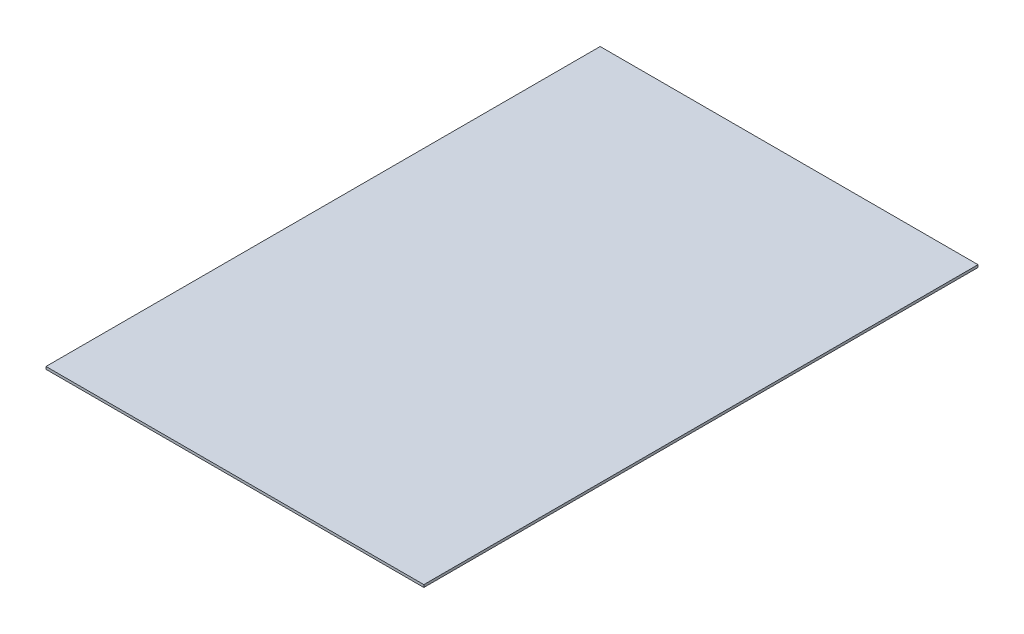
ISO-10303-21;
HEADER;
FILE_DESCRIPTION(('STEP AP214'),'2;1');
FILE_NAME('part.step','',(''),(''),'','','');
FILE_SCHEMA(('AUTOMOTIVE_DESIGN { 1 0 10303 214 1 1 1 1 }'));
ENDSEC;
DATA;
#1=APPLICATION_CONTEXT('core data for automotive mechanical design processes');
#2=APPLICATION_PROTOCOL_DEFINITION('international standard','automotive_design',2000,#1);
#3=PRODUCT_CONTEXT('',#1,'mechanical');
#4=PRODUCT('Part','Part','',(#3));
#5=PRODUCT_RELATED_PRODUCT_CATEGORY('part','',(#4));
#6=PRODUCT_DEFINITION_FORMATION('','',#4);
#7=PRODUCT_DEFINITION_CONTEXT('part definition',#1,'design');
#8=PRODUCT_DEFINITION('design','',#6,#7);
#9=PRODUCT_DEFINITION_SHAPE('','',#8);
#10=(LENGTH_UNIT() NAMED_UNIT(*) SI_UNIT(.MILLI.,.METRE.));
#11=(NAMED_UNIT(*) PLANE_ANGLE_UNIT() SI_UNIT($,.RADIAN.));
#12=(NAMED_UNIT(*) SI_UNIT($,.STERADIAN.) SOLID_ANGLE_UNIT());
#13=UNCERTAINTY_MEASURE_WITH_UNIT(LENGTH_MEASURE(1.E-05),#10,'distance_accuracy_value','');
#14=(GEOMETRIC_REPRESENTATION_CONTEXT(3) GLOBAL_UNCERTAINTY_ASSIGNED_CONTEXT((#13)) GLOBAL_UNIT_ASSIGNED_CONTEXT((#10,
#11,#12)) REPRESENTATION_CONTEXT('',''));
#15=CARTESIAN_POINT('',(0.,0.,0.));
#16=DIRECTION('',(0.,0.,1.));
#17=DIRECTION('',(1.,0.,0.));
#18=AXIS2_PLACEMENT_3D('',#15,#16,#17);
#19=CARTESIAN_POINT('',(-3750.,50.,5500.));
#20=DIRECTION('',(1.,0.,0.));
#21=DIRECTION('',(0.,0.,-1.));
#22=AXIS2_PLACEMENT_3D('',#19,#20,#21);
#23=PLANE('',#22);
#24=DIRECTION('',(0.,0.,1.));
#25=VECTOR('',#24,1.);
#26=CARTESIAN_POINT('',(-3750.,0.,5500.));
#27=LINE('',#26,#25);
#28=CARTESIAN_POINT('',(-3750.,0.,-5500.));
#29=VERTEX_POINT('',#28);
#30=CARTESIAN_POINT('',(-3750.,0.,5500.));
#31=VERTEX_POINT('',#30);
#32=EDGE_CURVE('E341',#29,#31,#27,.T.);
#33=ORIENTED_EDGE('',*,*,#32,.T.);
#34=DIRECTION('',(0.,-1.,0.));
#35=VECTOR('',#34,1.);
#36=CARTESIAN_POINT('',(-3750.,50.,5500.));
#37=LINE('',#36,#35);
#38=CARTESIAN_POINT('',(-3750.,50.,5500.));
#39=VERTEX_POINT('',#38);
#40=EDGE_CURVE('E11',#39,#31,#37,.T.);
#41=ORIENTED_EDGE('',*,*,#40,.F.);
#42=DIRECTION('',(0.,0.,1.));
#43=VECTOR('',#42,1.);
#44=CARTESIAN_POINT('',(-3750.,50.,5500.));
#45=LINE('',#44,#43);
#46=CARTESIAN_POINT('',(-3750.,50.,-5500.));
#47=VERTEX_POINT('',#46);
#48=EDGE_CURVE('E348',#47,#39,#45,.T.);
#49=ORIENTED_EDGE('',*,*,#48,.F.);
#50=DIRECTION('',(0.,-1.,0.));
#51=VECTOR('',#50,1.);
#52=CARTESIAN_POINT('',(-3750.,50.,-5500.));
#53=LINE('',#52,#51);
#54=EDGE_CURVE('E358',#47,#29,#53,.T.);
#55=ORIENTED_EDGE('',*,*,#54,.T.);
#56=EDGE_LOOP('',(#33,#41,#49,#55));
#57=FACE_BOUND('',#56,.T.);
#58=ADVANCED_FACE('F33',(#57),#23,.F.);
#59=CARTESIAN_POINT('',(3750.,50.,5500.));
#60=DIRECTION('',(0.,0.,-1.));
#61=DIRECTION('',(-1.,0.,0.));
#62=AXIS2_PLACEMENT_3D('',#59,#60,#61);
#63=PLANE('',#62);
#64=DIRECTION('',(1.,0.,0.));
#65=VECTOR('',#64,1.);
#66=CARTESIAN_POINT('',(3750.,0.,5500.));
#67=LINE('',#66,#65);
#68=CARTESIAN_POINT('',(3750.,0.,5500.));
#69=VERTEX_POINT('',#68);
#70=EDGE_CURVE('E361',#31,#69,#67,.T.);
#71=ORIENTED_EDGE('',*,*,#70,.T.);
#72=DIRECTION('',(0.,-1.,0.));
#73=VECTOR('',#72,1.);
#74=CARTESIAN_POINT('',(3750.,50.,5500.));
#75=LINE('',#74,#73);
#76=CARTESIAN_POINT('',(3750.,50.,5500.));
#77=VERTEX_POINT('',#76);
#78=EDGE_CURVE('E40',#77,#69,#75,.T.);
#79=ORIENTED_EDGE('',*,*,#78,.F.);
#80=DIRECTION('',(1.,0.,0.));
#81=VECTOR('',#80,1.);
#82=CARTESIAN_POINT('',(3750.,50.,5500.));
#83=LINE('',#82,#81);
#84=EDGE_CURVE('E351',#39,#77,#83,.T.);
#85=ORIENTED_EDGE('',*,*,#84,.F.);
#86=ORIENTED_EDGE('',*,*,#40,.T.);
#87=EDGE_LOOP('',(#71,#79,#85,#86));
#88=FACE_BOUND('',#87,.T.);
#89=ADVANCED_FACE('F390',(#88),#63,.F.);
#90=CARTESIAN_POINT('',(3750.,50.,5500.));
#91=DIRECTION('',(-1.,0.,0.));
#92=DIRECTION('',(0.,0.,1.));
#93=AXIS2_PLACEMENT_3D('',#90,#91,#92);
#94=PLANE('',#93);
#95=DIRECTION('',(0.,0.,-1.));
#96=VECTOR('',#95,1.);
#97=CARTESIAN_POINT('',(3750.,0.,5500.));
#98=LINE('',#97,#96);
#99=CARTESIAN_POINT('',(3750.,0.,-5500.));
#100=VERTEX_POINT('',#99);
#101=EDGE_CURVE('E363',#69,#100,#98,.T.);
#102=ORIENTED_EDGE('',*,*,#101,.T.);
#103=DIRECTION('',(0.,-1.,0.));
#104=VECTOR('',#103,1.);
#105=CARTESIAN_POINT('',(3750.,50.,-5500.));
#106=LINE('',#105,#104);
#107=CARTESIAN_POINT('',(3750.,50.,-5500.));
#108=VERTEX_POINT('',#107);
#109=EDGE_CURVE('E368',#108,#100,#106,.T.);
#110=ORIENTED_EDGE('',*,*,#109,.F.);
#111=DIRECTION('',(0.,0.,-1.));
#112=VECTOR('',#111,1.);
#113=CARTESIAN_POINT('',(3750.,50.,5500.));
#114=LINE('',#113,#112);
#115=EDGE_CURVE('E354',#77,#108,#114,.T.);
#116=ORIENTED_EDGE('',*,*,#115,.F.);
#117=ORIENTED_EDGE('',*,*,#78,.T.);
#118=EDGE_LOOP('',(#102,#110,#116,#117));
#119=FACE_BOUND('',#118,.T.);
#120=ADVANCED_FACE('F375',(#119),#94,.F.);
#121=CARTESIAN_POINT('',(3750.,50.,-5500.));
#122=DIRECTION('',(0.,0.,1.));
#123=DIRECTION('',(1.,0.,0.));
#124=AXIS2_PLACEMENT_3D('',#121,#122,#123);
#125=PLANE('',#124);
#126=DIRECTION('',(-1.,0.,0.));
#127=VECTOR('',#126,1.);
#128=CARTESIAN_POINT('',(3750.,0.,-5500.));
#129=LINE('',#128,#127);
#130=EDGE_CURVE('E352',#100,#29,#129,.T.);
#131=ORIENTED_EDGE('',*,*,#130,.T.);
#132=ORIENTED_EDGE('',*,*,#54,.F.);
#133=DIRECTION('',(-1.,0.,0.));
#134=VECTOR('',#133,1.);
#135=CARTESIAN_POINT('',(3750.,50.,-5500.));
#136=LINE('',#135,#134);
#137=EDGE_CURVE('E356',#108,#47,#136,.T.);
#138=ORIENTED_EDGE('',*,*,#137,.F.);
#139=ORIENTED_EDGE('',*,*,#109,.T.);
#140=EDGE_LOOP('',(#131,#132,#138,#139));
#141=FACE_BOUND('',#140,.T.);
#142=ADVANCED_FACE('F383',(#141),#125,.F.);
#143=CARTESIAN_POINT('',(0.,50.,0.));
#144=DIRECTION('',(0.,1.,0.));
#145=DIRECTION('',(0.,0.,1.));
#146=AXIS2_PLACEMENT_3D('',#143,#144,#145);
#147=PLANE('',#146);
#148=ORIENTED_EDGE('',*,*,#48,.T.);
#149=ORIENTED_EDGE('',*,*,#84,.T.);
#150=ORIENTED_EDGE('',*,*,#115,.T.);
#151=ORIENTED_EDGE('',*,*,#137,.T.);
#152=EDGE_LOOP('',(#148,#149,#150,#151));
#153=FACE_BOUND('',#152,.T.);
#154=ADVANCED_FACE('F389',(#153),#147,.T.);
#155=CARTESIAN_POINT('',(0.,0.,0.));
#156=DIRECTION('',(0.,1.,0.));
#157=DIRECTION('',(0.,0.,1.));
#158=AXIS2_PLACEMENT_3D('',#155,#156,#157);
#159=PLANE('',#158);
#160=DIRECTION('',(-1.,0.,0.));
#161=VECTOR('',#160,1.);
#162=CARTESIAN_POINT('',(249.999999999999,0.,1500.));
#163=LINE('',#162,#161);
#164=CARTESIAN_POINT('',(249.999999999999,0.,1500.));
#165=VERTEX_POINT('',#164);
#166=CARTESIAN_POINT('',(-250.000000000001,0.,1500.));
#167=VERTEX_POINT('',#166);
#168=EDGE_CURVE('E308',#165,#167,#163,.T.);
#169=ORIENTED_EDGE('',*,*,#168,.F.);
#170=DIRECTION('',(0.,0.,1.));
#171=VECTOR('',#170,1.);
#172=CARTESIAN_POINT('',(249.999999999999,0.,1000.));
#173=LINE('',#172,#171);
#174=CARTESIAN_POINT('',(249.999999999999,0.,1000.));
#175=VERTEX_POINT('',#174);
#176=EDGE_CURVE('E47',#175,#165,#173,.T.);
#177=ORIENTED_EDGE('',*,*,#176,.F.);
#178=DIRECTION('',(-1.,0.,0.));
#179=VECTOR('',#178,1.);
#180=CARTESIAN_POINT('',(249.999999999999,0.,1000.));
#181=LINE('',#180,#179);
#182=CARTESIAN_POINT('',(-250.000000000001,0.,1000.));
#183=VERTEX_POINT('',#182);
#184=EDGE_CURVE('E301',#175,#183,#181,.T.);
#185=ORIENTED_EDGE('',*,*,#184,.T.);
#186=DIRECTION('',(0.,0.,1.));
#187=VECTOR('',#186,1.);
#188=CARTESIAN_POINT('',(-250.000000000001,0.,1000.));
#189=LINE('',#188,#187);
#190=EDGE_CURVE('E304',#183,#167,#189,.T.);
#191=ORIENTED_EDGE('',*,*,#190,.T.);
#192=EDGE_LOOP('',(#169,#177,#185,#191));
#193=FACE_BOUND('',#192,.T.);
#194=DIRECTION('',(0.,0.,1.));
#195=VECTOR('',#194,1.);
#196=CARTESIAN_POINT('',(2250.,0.,0.));
#197=LINE('',#196,#195);
#198=CARTESIAN_POINT('',(2250.,0.,-3375.));
#199=VERTEX_POINT('',#198);
#200=CARTESIAN_POINT('',(2250.,0.,-2625.));
#201=VERTEX_POINT('',#200);
#202=EDGE_CURVE('E280',#199,#201,#197,.T.);
#203=ORIENTED_EDGE('',*,*,#202,.F.);
#204=DIRECTION('',(1.,0.,0.));
#205=VECTOR('',#204,1.);
#206=CARTESIAN_POINT('',(0.,0.,-3375.));
#207=LINE('',#206,#205);
#208=CARTESIAN_POINT('',(1500.,0.,-3375.));
#209=VERTEX_POINT('',#208);
#210=EDGE_CURVE('E55',#209,#199,#207,.T.);
#211=ORIENTED_EDGE('',*,*,#210,.F.);
#212=DIRECTION('',(0.,0.,1.));
#213=VECTOR('',#212,1.);
#214=CARTESIAN_POINT('',(1500.,0.,0.));
#215=LINE('',#214,#213);
#216=CARTESIAN_POINT('',(1500.,0.,-2625.));
#217=VERTEX_POINT('',#216);
#218=EDGE_CURVE('E273',#209,#217,#215,.T.);
#219=ORIENTED_EDGE('',*,*,#218,.T.);
#220=DIRECTION('',(1.,0.,0.));
#221=VECTOR('',#220,1.);
#222=CARTESIAN_POINT('',(0.,0.,-2625.));
#223=LINE('',#222,#221);
#224=EDGE_CURVE('E276',#217,#201,#223,.T.);
#225=ORIENTED_EDGE('',*,*,#224,.T.);
#226=EDGE_LOOP('',(#203,#211,#219,#225));
#227=FACE_BOUND('',#226,.T.);
#228=DIRECTION('',(0.,0.,1.));
#229=VECTOR('',#228,1.);
#230=CARTESIAN_POINT('',(-1500.,0.,0.));
#231=LINE('',#230,#229);
#232=CARTESIAN_POINT('',(-1500.,0.,-3375.));
#233=VERTEX_POINT('',#232);
#234=CARTESIAN_POINT('',(-1500.,0.,-2625.));
#235=VERTEX_POINT('',#234);
#236=EDGE_CURVE('E252',#233,#235,#231,.T.);
#237=ORIENTED_EDGE('',*,*,#236,.F.);
#238=DIRECTION('',(1.,0.,0.));
#239=VECTOR('',#238,1.);
#240=CARTESIAN_POINT('',(0.,0.,-3375.));
#241=LINE('',#240,#239);
#242=CARTESIAN_POINT('',(-2250.,0.,-3375.));
#243=VERTEX_POINT('',#242);
#244=EDGE_CURVE('E203',#243,#233,#241,.T.);
#245=ORIENTED_EDGE('',*,*,#244,.F.);
#246=DIRECTION('',(0.,0.,1.));
#247=VECTOR('',#246,1.);
#248=CARTESIAN_POINT('',(-2250.,0.,0.));
#249=LINE('',#248,#247);
#250=CARTESIAN_POINT('',(-2250.,0.,-2625.));
#251=VERTEX_POINT('',#250);
#252=EDGE_CURVE('E245',#243,#251,#249,.T.);
#253=ORIENTED_EDGE('',*,*,#252,.T.);
#254=DIRECTION('',(1.,0.,0.));
#255=VECTOR('',#254,1.);
#256=CARTESIAN_POINT('',(0.,0.,-2625.));
#257=LINE('',#256,#255);
#258=EDGE_CURVE('E248',#251,#235,#257,.T.);
#259=ORIENTED_EDGE('',*,*,#258,.T.);
#260=EDGE_LOOP('',(#237,#245,#253,#259));
#261=FACE_BOUND('',#260,.T.);
#262=DIRECTION('',(0.,0.,1.));
#263=VECTOR('',#262,1.);
#264=CARTESIAN_POINT('',(-1500.,0.,0.));
#265=LINE('',#264,#263);
#266=CARTESIAN_POINT('',(-1500.,0.,2625.));
#267=VERTEX_POINT('',#266);
#268=CARTESIAN_POINT('',(-1500.,0.,3375.));
#269=VERTEX_POINT('',#268);
#270=EDGE_CURVE('E218',#267,#269,#265,.T.);
#271=ORIENTED_EDGE('',*,*,#270,.F.);
#272=DIRECTION('',(1.,0.,0.));
#273=VECTOR('',#272,1.);
#274=CARTESIAN_POINT('',(0.,0.,2625.));
#275=LINE('',#274,#273);
#276=CARTESIAN_POINT('',(-2250.,0.,2625.));
#277=VERTEX_POINT('',#276);
#278=EDGE_CURVE('E196',#277,#267,#275,.T.);
#279=ORIENTED_EDGE('',*,*,#278,.F.);
#280=DIRECTION('',(0.,0.,1.));
#281=VECTOR('',#280,1.);
#282=CARTESIAN_POINT('',(-2250.,0.,0.));
#283=LINE('',#282,#281);
#284=CARTESIAN_POINT('',(-2250.,0.,3375.));
#285=VERTEX_POINT('',#284);
#286=EDGE_CURVE('E206',#277,#285,#283,.T.);
#287=ORIENTED_EDGE('',*,*,#286,.T.);
#288=DIRECTION('',(1.,0.,0.));
#289=VECTOR('',#288,1.);
#290=CARTESIAN_POINT('',(0.,0.,3375.));
#291=LINE('',#290,#289);
#292=EDGE_CURVE('E212',#285,#269,#291,.T.);
#293=ORIENTED_EDGE('',*,*,#292,.T.);
#294=EDGE_LOOP('',(#271,#279,#287,#293));
#295=FACE_BOUND('',#294,.T.);
#296=DIRECTION('',(0.,0.,1.));
#297=VECTOR('',#296,1.);
#298=CARTESIAN_POINT('',(2250.,0.,0.));
#299=LINE('',#298,#297);
#300=CARTESIAN_POINT('',(2250.,0.,2625.));
#301=VERTEX_POINT('',#300);
#302=CARTESIAN_POINT('',(2250.,0.,3375.));
#303=VERTEX_POINT('',#302);
#304=EDGE_CURVE('E221',#301,#303,#299,.T.);
#305=ORIENTED_EDGE('',*,*,#304,.F.);
#306=DIRECTION('',(1.,0.,0.));
#307=VECTOR('',#306,1.);
#308=CARTESIAN_POINT('',(0.,0.,2625.));
#309=LINE('',#308,#307);
#310=CARTESIAN_POINT('',(1500.,0.,2625.));
#311=VERTEX_POINT('',#310);
#312=EDGE_CURVE('E219',#311,#301,#309,.T.);
#313=ORIENTED_EDGE('',*,*,#312,.F.);
#314=DIRECTION('',(0.,0.,1.));
#315=VECTOR('',#314,1.);
#316=CARTESIAN_POINT('',(1500.,0.,0.));
#317=LINE('',#316,#315);
#318=CARTESIAN_POINT('',(1500.,0.,3375.));
#319=VERTEX_POINT('',#318);
#320=EDGE_CURVE('E324',#311,#319,#317,.T.);
#321=ORIENTED_EDGE('',*,*,#320,.T.);
#322=DIRECTION('',(1.,0.,0.));
#323=VECTOR('',#322,1.);
#324=CARTESIAN_POINT('',(0.,0.,3375.));
#325=LINE('',#324,#323);
#326=EDGE_CURVE('E334',#319,#303,#325,.T.);
#327=ORIENTED_EDGE('',*,*,#326,.T.);
#328=EDGE_LOOP('',(#305,#313,#321,#327));
#329=FACE_BOUND('',#328,.T.);
#330=ORIENTED_EDGE('',*,*,#32,.F.);
#331=ORIENTED_EDGE('',*,*,#130,.F.);
#332=ORIENTED_EDGE('',*,*,#101,.F.);
#333=ORIENTED_EDGE('',*,*,#70,.F.);
#334=EDGE_LOOP('',(#330,#331,#332,#333));
#335=FACE_BOUND('',#334,.T.);
#336=ADVANCED_FACE('F215',(#193,#227,#261,#295,#329,#335),#159,.F.);
#337=CARTESIAN_POINT('',(0.,10.,2625.));
#338=DIRECTION('',(0.,0.,-1.));
#339=DIRECTION('',(-1.,0.,0.));
#340=AXIS2_PLACEMENT_3D('',#337,#338,#339);
#341=PLANE('',#340);
#342=ORIENTED_EDGE('',*,*,#312,.T.);
#343=DIRECTION('',(0.,-1.,0.));
#344=VECTOR('',#343,1.);
#345=CARTESIAN_POINT('',(2250.,10.,2625.));
#346=LINE('',#345,#344);
#347=CARTESIAN_POINT('',(2250.,10.,2625.));
#348=VERTEX_POINT('',#347);
#349=EDGE_CURVE('E330',#348,#301,#346,.T.);
#350=ORIENTED_EDGE('',*,*,#349,.F.);
#351=DIRECTION('',(1.,0.,0.));
#352=VECTOR('',#351,1.);
#353=CARTESIAN_POINT('',(0.,10.,2625.));
#354=LINE('',#353,#352);
#355=CARTESIAN_POINT('',(1500.,10.,2625.));
#356=VERTEX_POINT('',#355);
#357=EDGE_CURVE('E320',#356,#348,#354,.T.);
#358=ORIENTED_EDGE('',*,*,#357,.F.);
#359=DIRECTION('',(0.,-1.,0.));
#360=VECTOR('',#359,1.);
#361=CARTESIAN_POINT('',(1500.,10.,2625.));
#362=LINE('',#361,#360);
#363=EDGE_CURVE('E339',#356,#311,#362,.T.);
#364=ORIENTED_EDGE('',*,*,#363,.T.);
#365=EDGE_LOOP('',(#342,#350,#358,#364));
#366=FACE_BOUND('',#365,.T.);
#367=ADVANCED_FACE('F402',(#366),#341,.F.);
#368=CARTESIAN_POINT('',(1500.,10.,0.));
#369=DIRECTION('',(1.,0.,0.));
#370=DIRECTION('',(0.,0.,-1.));
#371=AXIS2_PLACEMENT_3D('',#368,#369,#370);
#372=PLANE('',#371);
#373=ORIENTED_EDGE('',*,*,#320,.F.);
#374=ORIENTED_EDGE('',*,*,#363,.F.);
#375=DIRECTION('',(0.,0.,1.));
#376=VECTOR('',#375,1.);
#377=CARTESIAN_POINT('',(1500.,10.,0.));
#378=LINE('',#377,#376);
#379=CARTESIAN_POINT('',(1500.,10.,3375.));
#380=VERTEX_POINT('',#379);
#381=EDGE_CURVE('E329',#356,#380,#378,.T.);
#382=ORIENTED_EDGE('',*,*,#381,.T.);
#383=DIRECTION('',(0.,-1.,0.));
#384=VECTOR('',#383,1.);
#385=CARTESIAN_POINT('',(1500.,10.,3375.));
#386=LINE('',#385,#384);
#387=EDGE_CURVE('E342',#380,#319,#386,.T.);
#388=ORIENTED_EDGE('',*,*,#387,.T.);
#389=EDGE_LOOP('',(#373,#374,#382,#388));
#390=FACE_BOUND('',#389,.T.);
#391=ADVANCED_FACE('F408',(#390),#372,.T.);
#392=CARTESIAN_POINT('',(0.,10.,3375.));
#393=DIRECTION('',(0.,0.,-1.));
#394=DIRECTION('',(-1.,0.,0.));
#395=AXIS2_PLACEMENT_3D('',#392,#393,#394);
#396=PLANE('',#395);
#397=ORIENTED_EDGE('',*,*,#326,.F.);
#398=ORIENTED_EDGE('',*,*,#387,.F.);
#399=DIRECTION('',(1.,0.,0.));
#400=VECTOR('',#399,1.);
#401=CARTESIAN_POINT('',(0.,10.,3375.));
#402=LINE('',#401,#400);
#403=CARTESIAN_POINT('',(2250.,10.,3375.));
#404=VERTEX_POINT('',#403);
#405=EDGE_CURVE('E327',#380,#404,#402,.T.);
#406=ORIENTED_EDGE('',*,*,#405,.T.);
#407=DIRECTION('',(0.,-1.,0.));
#408=VECTOR('',#407,1.);
#409=CARTESIAN_POINT('',(2250.,10.,3375.));
#410=LINE('',#409,#408);
#411=EDGE_CURVE('E344',#404,#303,#410,.T.);
#412=ORIENTED_EDGE('',*,*,#411,.T.);
#413=EDGE_LOOP('',(#397,#398,#406,#412));
#414=FACE_BOUND('',#413,.T.);
#415=ADVANCED_FACE('F414',(#414),#396,.T.);
#416=CARTESIAN_POINT('',(2250.,10.,0.));
#417=DIRECTION('',(1.,0.,0.));
#418=DIRECTION('',(0.,0.,-1.));
#419=AXIS2_PLACEMENT_3D('',#416,#417,#418);
#420=PLANE('',#419);
#421=ORIENTED_EDGE('',*,*,#304,.T.);
#422=ORIENTED_EDGE('',*,*,#411,.F.);
#423=DIRECTION('',(0.,0.,1.));
#424=VECTOR('',#423,1.);
#425=CARTESIAN_POINT('',(2250.,10.,0.));
#426=LINE('',#425,#424);
#427=EDGE_CURVE('E323',#348,#404,#426,.T.);
#428=ORIENTED_EDGE('',*,*,#427,.F.);
#429=ORIENTED_EDGE('',*,*,#349,.T.);
#430=EDGE_LOOP('',(#421,#422,#428,#429));
#431=FACE_BOUND('',#430,.T.);
#432=ADVANCED_FACE('F410',(#431),#420,.F.);
#433=CARTESIAN_POINT('',(0.,10.,0.));
#434=DIRECTION('',(0.,-1.,0.));
#435=DIRECTION('',(0.,0.,-1.));
#436=AXIS2_PLACEMENT_3D('',#433,#434,#435);
#437=PLANE('',#436);
#438=ORIENTED_EDGE('',*,*,#357,.T.);
#439=ORIENTED_EDGE('',*,*,#427,.T.);
#440=ORIENTED_EDGE('',*,*,#405,.F.);
#441=ORIENTED_EDGE('',*,*,#381,.F.);
#442=EDGE_LOOP('',(#438,#439,#440,#441));
#443=FACE_BOUND('',#442,.T.);
#444=ADVANCED_FACE('F413',(#443),#437,.T.);
#445=CARTESIAN_POINT('',(0.,10.,2625.));
#446=DIRECTION('',(0.,0.,-1.));
#447=DIRECTION('',(-1.,0.,0.));
#448=AXIS2_PLACEMENT_3D('',#445,#446,#447);
#449=PLANE('',#448);
#450=ORIENTED_EDGE('',*,*,#278,.T.);
#451=DIRECTION('',(0.,-1.,0.));
#452=VECTOR('',#451,1.);
#453=CARTESIAN_POINT('',(-1500.,10.,2625.));
#454=LINE('',#453,#452);
#455=CARTESIAN_POINT('',(-1500.,10.,2625.));
#456=VERTEX_POINT('',#455);
#457=EDGE_CURVE('E229',#456,#267,#454,.T.);
#458=ORIENTED_EDGE('',*,*,#457,.F.);
#459=DIRECTION('',(1.,0.,0.));
#460=VECTOR('',#459,1.);
#461=CARTESIAN_POINT('',(0.,10.,2625.));
#462=LINE('',#461,#460);
#463=CARTESIAN_POINT('',(-2250.,10.,2625.));
#464=VERTEX_POINT('',#463);
#465=EDGE_CURVE('E199',#464,#456,#462,.T.);
#466=ORIENTED_EDGE('',*,*,#465,.F.);
#467=DIRECTION('',(0.,-1.,0.));
#468=VECTOR('',#467,1.);
#469=CARTESIAN_POINT('',(-2250.,10.,2625.));
#470=LINE('',#469,#468);
#471=EDGE_CURVE('E192',#464,#277,#470,.T.);
#472=ORIENTED_EDGE('',*,*,#471,.T.);
#473=EDGE_LOOP('',(#450,#458,#466,#472));
#474=FACE_BOUND('',#473,.T.);
#475=ADVANCED_FACE('F194',(#474),#449,.F.);
#476=CARTESIAN_POINT('',(-2250.,10.,0.));
#477=DIRECTION('',(1.,0.,0.));
#478=DIRECTION('',(0.,0.,-1.));
#479=AXIS2_PLACEMENT_3D('',#476,#477,#478);
#480=PLANE('',#479);
#481=ORIENTED_EDGE('',*,*,#286,.F.);
#482=ORIENTED_EDGE('',*,*,#471,.F.);
#483=DIRECTION('',(0.,0.,1.));
#484=VECTOR('',#483,1.);
#485=CARTESIAN_POINT('',(-2250.,10.,0.));
#486=LINE('',#485,#484);
#487=CARTESIAN_POINT('',(-2250.,10.,3375.));
#488=VERTEX_POINT('',#487);
#489=EDGE_CURVE('E226',#464,#488,#486,.T.);
#490=ORIENTED_EDGE('',*,*,#489,.T.);
#491=DIRECTION('',(0.,-1.,0.));
#492=VECTOR('',#491,1.);
#493=CARTESIAN_POINT('',(-2250.,10.,3375.));
#494=LINE('',#493,#492);
#495=EDGE_CURVE('E202',#488,#285,#494,.T.);
#496=ORIENTED_EDGE('',*,*,#495,.T.);
#497=EDGE_LOOP('',(#481,#482,#490,#496));
#498=FACE_BOUND('',#497,.T.);
#499=ADVANCED_FACE('F207',(#498),#480,.T.);
#500=CARTESIAN_POINT('',(0.,10.,3375.));
#501=DIRECTION('',(0.,0.,-1.));
#502=DIRECTION('',(-1.,0.,0.));
#503=AXIS2_PLACEMENT_3D('',#500,#501,#502);
#504=PLANE('',#503);
#505=ORIENTED_EDGE('',*,*,#292,.F.);
#506=ORIENTED_EDGE('',*,*,#495,.F.);
#507=DIRECTION('',(1.,0.,0.));
#508=VECTOR('',#507,1.);
#509=CARTESIAN_POINT('',(0.,10.,3375.));
#510=LINE('',#509,#508);
#511=CARTESIAN_POINT('',(-1500.,10.,3375.));
#512=VERTEX_POINT('',#511);
#513=EDGE_CURVE('E228',#488,#512,#510,.T.);
#514=ORIENTED_EDGE('',*,*,#513,.T.);
#515=DIRECTION('',(0.,-1.,0.));
#516=VECTOR('',#515,1.);
#517=CARTESIAN_POINT('',(-1500.,10.,3375.));
#518=LINE('',#517,#516);
#519=EDGE_CURVE('E684',#512,#269,#518,.T.);
#520=ORIENTED_EDGE('',*,*,#519,.T.);
#521=EDGE_LOOP('',(#505,#506,#514,#520));
#522=FACE_BOUND('',#521,.T.);
#523=ADVANCED_FACE('F490',(#522),#504,.T.);
#524=CARTESIAN_POINT('',(-1500.,10.,0.));
#525=DIRECTION('',(1.,0.,0.));
#526=DIRECTION('',(0.,0.,-1.));
#527=AXIS2_PLACEMENT_3D('',#524,#525,#526);
#528=PLANE('',#527);
#529=ORIENTED_EDGE('',*,*,#270,.T.);
#530=ORIENTED_EDGE('',*,*,#519,.F.);
#531=DIRECTION('',(0.,0.,1.));
#532=VECTOR('',#531,1.);
#533=CARTESIAN_POINT('',(-1500.,10.,0.));
#534=LINE('',#533,#532);
#535=EDGE_CURVE('E231',#456,#512,#534,.T.);
#536=ORIENTED_EDGE('',*,*,#535,.F.);
#537=ORIENTED_EDGE('',*,*,#457,.T.);
#538=EDGE_LOOP('',(#529,#530,#536,#537));
#539=FACE_BOUND('',#538,.T.);
#540=ADVANCED_FACE('F486',(#539),#528,.F.);
#541=CARTESIAN_POINT('',(0.,10.,0.));
#542=DIRECTION('',(0.,-1.,0.));
#543=DIRECTION('',(0.,0.,-1.));
#544=AXIS2_PLACEMENT_3D('',#541,#542,#543);
#545=PLANE('',#544);
#546=ORIENTED_EDGE('',*,*,#465,.T.);
#547=ORIENTED_EDGE('',*,*,#535,.T.);
#548=ORIENTED_EDGE('',*,*,#513,.F.);
#549=ORIENTED_EDGE('',*,*,#489,.F.);
#550=EDGE_LOOP('',(#546,#547,#548,#549));
#551=FACE_BOUND('',#550,.T.);
#552=ADVANCED_FACE('F482',(#551),#545,.T.);
#553=CARTESIAN_POINT('',(0.,10.,-3375.));
#554=DIRECTION('',(0.,0.,-1.));
#555=DIRECTION('',(-1.,0.,0.));
#556=AXIS2_PLACEMENT_3D('',#553,#554,#555);
#557=PLANE('',#556);
#558=ORIENTED_EDGE('',*,*,#244,.T.);
#559=DIRECTION('',(0.,-1.,0.));
#560=VECTOR('',#559,1.);
#561=CARTESIAN_POINT('',(-1500.,10.,-3375.));
#562=LINE('',#561,#560);
#563=CARTESIAN_POINT('',(-1500.,10.,-3375.));
#564=VERTEX_POINT('',#563);
#565=EDGE_CURVE('E235',#564,#233,#562,.T.);
#566=ORIENTED_EDGE('',*,*,#565,.F.);
#567=DIRECTION('',(1.,0.,0.));
#568=VECTOR('',#567,1.);
#569=CARTESIAN_POINT('',(0.,10.,-3375.));
#570=LINE('',#569,#568);
#571=CARTESIAN_POINT('',(-2250.,10.,-3375.));
#572=VERTEX_POINT('',#571);
#573=EDGE_CURVE('E249',#572,#564,#570,.T.);
#574=ORIENTED_EDGE('',*,*,#573,.F.);
#575=DIRECTION('',(0.,-1.,0.));
#576=VECTOR('',#575,1.);
#577=CARTESIAN_POINT('',(-2250.,10.,-3375.));
#578=LINE('',#577,#576);
#579=EDGE_CURVE('E243',#572,#243,#578,.T.);
#580=ORIENTED_EDGE('',*,*,#579,.T.);
#581=EDGE_LOOP('',(#558,#566,#574,#580));
#582=FACE_BOUND('',#581,.T.);
#583=ADVANCED_FACE('F472',(#582),#557,.F.);
#584=CARTESIAN_POINT('',(-2250.,10.,0.));
#585=DIRECTION('',(1.,0.,0.));
#586=DIRECTION('',(0.,0.,-1.));
#587=AXIS2_PLACEMENT_3D('',#584,#585,#586);
#588=PLANE('',#587);
#589=ORIENTED_EDGE('',*,*,#252,.F.);
#590=ORIENTED_EDGE('',*,*,#579,.F.);
#591=DIRECTION('',(0.,0.,1.));
#592=VECTOR('',#591,1.);
#593=CARTESIAN_POINT('',(-2250.,10.,0.));
#594=LINE('',#593,#592);
#595=CARTESIAN_POINT('',(-2250.,10.,-2625.));
#596=VERTEX_POINT('',#595);
#597=EDGE_CURVE('E238',#572,#596,#594,.T.);
#598=ORIENTED_EDGE('',*,*,#597,.T.);
#599=DIRECTION('',(0.,-1.,0.));
#600=VECTOR('',#599,1.);
#601=CARTESIAN_POINT('',(-2250.,10.,-2625.));
#602=LINE('',#601,#600);
#603=EDGE_CURVE('E241',#596,#251,#602,.T.);
#604=ORIENTED_EDGE('',*,*,#603,.T.);
#605=EDGE_LOOP('',(#589,#590,#598,#604));
#606=FACE_BOUND('',#605,.T.);
#607=ADVANCED_FACE('F468',(#606),#588,.T.);
#608=CARTESIAN_POINT('',(0.,10.,-2625.));
#609=DIRECTION('',(0.,0.,-1.));
#610=DIRECTION('',(-1.,0.,0.));
#611=AXIS2_PLACEMENT_3D('',#608,#609,#610);
#612=PLANE('',#611);
#613=ORIENTED_EDGE('',*,*,#258,.F.);
#614=ORIENTED_EDGE('',*,*,#603,.F.);
#615=DIRECTION('',(1.,0.,0.));
#616=VECTOR('',#615,1.);
#617=CARTESIAN_POINT('',(0.,10.,-2625.));
#618=LINE('',#617,#616);
#619=CARTESIAN_POINT('',(-1500.,10.,-2625.));
#620=VERTEX_POINT('',#619);
#621=EDGE_CURVE('E257',#596,#620,#618,.T.);
#622=ORIENTED_EDGE('',*,*,#621,.T.);
#623=DIRECTION('',(0.,-1.,0.));
#624=VECTOR('',#623,1.);
#625=CARTESIAN_POINT('',(-1500.,10.,-2625.));
#626=LINE('',#625,#624);
#627=EDGE_CURVE('E239',#620,#235,#626,.T.);
#628=ORIENTED_EDGE('',*,*,#627,.T.);
#629=EDGE_LOOP('',(#613,#614,#622,#628));
#630=FACE_BOUND('',#629,.T.);
#631=ADVANCED_FACE('F471',(#630),#612,.T.);
#632=CARTESIAN_POINT('',(-1500.,10.,0.));
#633=DIRECTION('',(1.,0.,0.));
#634=DIRECTION('',(0.,0.,-1.));
#635=AXIS2_PLACEMENT_3D('',#632,#633,#634);
#636=PLANE('',#635);
#637=ORIENTED_EDGE('',*,*,#236,.T.);
#638=ORIENTED_EDGE('',*,*,#627,.F.);
#639=DIRECTION('',(0.,0.,1.));
#640=VECTOR('',#639,1.);
#641=CARTESIAN_POINT('',(-1500.,10.,0.));
#642=LINE('',#641,#640);
#643=EDGE_CURVE('E259',#564,#620,#642,.T.);
#644=ORIENTED_EDGE('',*,*,#643,.F.);
#645=ORIENTED_EDGE('',*,*,#565,.T.);
#646=EDGE_LOOP('',(#637,#638,#644,#645));
#647=FACE_BOUND('',#646,.T.);
#648=ADVANCED_FACE('F466',(#647),#636,.F.);
#649=CARTESIAN_POINT('',(0.,10.,0.));
#650=DIRECTION('',(0.,-1.,0.));
#651=DIRECTION('',(0.,0.,-1.));
#652=AXIS2_PLACEMENT_3D('',#649,#650,#651);
#653=PLANE('',#652);
#654=ORIENTED_EDGE('',*,*,#573,.T.);
#655=ORIENTED_EDGE('',*,*,#643,.T.);
#656=ORIENTED_EDGE('',*,*,#621,.F.);
#657=ORIENTED_EDGE('',*,*,#597,.F.);
#658=EDGE_LOOP('',(#654,#655,#656,#657));
#659=FACE_BOUND('',#658,.T.);
#660=ADVANCED_FACE('F463',(#659),#653,.T.);
#661=CARTESIAN_POINT('',(0.,10.,-3375.));
#662=DIRECTION('',(0.,0.,-1.));
#663=DIRECTION('',(-1.,0.,0.));
#664=AXIS2_PLACEMENT_3D('',#661,#662,#663);
#665=PLANE('',#664);
#666=ORIENTED_EDGE('',*,*,#210,.T.);
#667=DIRECTION('',(0.,-1.,0.));
#668=VECTOR('',#667,1.);
#669=CARTESIAN_POINT('',(2250.,10.,-3375.));
#670=LINE('',#669,#668);
#671=CARTESIAN_POINT('',(2250.,10.,-3375.));
#672=VERTEX_POINT('',#671);
#673=EDGE_CURVE('E264',#672,#199,#670,.T.);
#674=ORIENTED_EDGE('',*,*,#673,.F.);
#675=DIRECTION('',(1.,0.,0.));
#676=VECTOR('',#675,1.);
#677=CARTESIAN_POINT('',(0.,10.,-3375.));
#678=LINE('',#677,#676);
#679=CARTESIAN_POINT('',(1500.,10.,-3375.));
#680=VERTEX_POINT('',#679);
#681=EDGE_CURVE('E277',#680,#672,#678,.T.);
#682=ORIENTED_EDGE('',*,*,#681,.F.);
#683=DIRECTION('',(0.,-1.,0.));
#684=VECTOR('',#683,1.);
#685=CARTESIAN_POINT('',(1500.,10.,-3375.));
#686=LINE('',#685,#684);
#687=EDGE_CURVE('E271',#680,#209,#686,.T.);
#688=ORIENTED_EDGE('',*,*,#687,.T.);
#689=EDGE_LOOP('',(#666,#674,#682,#688));
#690=FACE_BOUND('',#689,.T.);
#691=ADVANCED_FACE('F453',(#690),#665,.F.);
#692=CARTESIAN_POINT('',(1500.,10.,0.));
#693=DIRECTION('',(1.,0.,0.));
#694=DIRECTION('',(0.,0.,-1.));
#695=AXIS2_PLACEMENT_3D('',#692,#693,#694);
#696=PLANE('',#695);
#697=ORIENTED_EDGE('',*,*,#218,.F.);
#698=ORIENTED_EDGE('',*,*,#687,.F.);
#699=DIRECTION('',(0.,0.,1.));
#700=VECTOR('',#699,1.);
#701=CARTESIAN_POINT('',(1500.,10.,0.));
#702=LINE('',#701,#700);
#703=CARTESIAN_POINT('',(1500.,10.,-2625.));
#704=VERTEX_POINT('',#703);
#705=EDGE_CURVE('E266',#680,#704,#702,.T.);
#706=ORIENTED_EDGE('',*,*,#705,.T.);
#707=DIRECTION('',(0.,-1.,0.));
#708=VECTOR('',#707,1.);
#709=CARTESIAN_POINT('',(1500.,10.,-2625.));
#710=LINE('',#709,#708);
#711=EDGE_CURVE('E269',#704,#217,#710,.T.);
#712=ORIENTED_EDGE('',*,*,#711,.T.);
#713=EDGE_LOOP('',(#697,#698,#706,#712));
#714=FACE_BOUND('',#713,.T.);
#715=ADVANCED_FACE('F449',(#714),#696,.T.);
#716=CARTESIAN_POINT('',(0.,10.,-2625.));
#717=DIRECTION('',(0.,0.,-1.));
#718=DIRECTION('',(-1.,0.,0.));
#719=AXIS2_PLACEMENT_3D('',#716,#717,#718);
#720=PLANE('',#719);
#721=ORIENTED_EDGE('',*,*,#224,.F.);
#722=ORIENTED_EDGE('',*,*,#711,.F.);
#723=DIRECTION('',(1.,0.,0.));
#724=VECTOR('',#723,1.);
#725=CARTESIAN_POINT('',(0.,10.,-2625.));
#726=LINE('',#725,#724);
#727=CARTESIAN_POINT('',(2250.,10.,-2625.));
#728=VERTEX_POINT('',#727);
#729=EDGE_CURVE('E285',#704,#728,#726,.T.);
#730=ORIENTED_EDGE('',*,*,#729,.T.);
#731=DIRECTION('',(0.,-1.,0.));
#732=VECTOR('',#731,1.);
#733=CARTESIAN_POINT('',(2250.,10.,-2625.));
#734=LINE('',#733,#732);
#735=EDGE_CURVE('E267',#728,#201,#734,.T.);
#736=ORIENTED_EDGE('',*,*,#735,.T.);
#737=EDGE_LOOP('',(#721,#722,#730,#736));
#738=FACE_BOUND('',#737,.T.);
#739=ADVANCED_FACE('F452',(#738),#720,.T.);
#740=CARTESIAN_POINT('',(2250.,10.,0.));
#741=DIRECTION('',(1.,0.,0.));
#742=DIRECTION('',(0.,0.,-1.));
#743=AXIS2_PLACEMENT_3D('',#740,#741,#742);
#744=PLANE('',#743);
#745=ORIENTED_EDGE('',*,*,#202,.T.);
#746=ORIENTED_EDGE('',*,*,#735,.F.);
#747=DIRECTION('',(0.,0.,1.));
#748=VECTOR('',#747,1.);
#749=CARTESIAN_POINT('',(2250.,10.,0.));
#750=LINE('',#749,#748);
#751=EDGE_CURVE('E287',#672,#728,#750,.T.);
#752=ORIENTED_EDGE('',*,*,#751,.F.);
#753=ORIENTED_EDGE('',*,*,#673,.T.);
#754=EDGE_LOOP('',(#745,#746,#752,#753));
#755=FACE_BOUND('',#754,.T.);
#756=ADVANCED_FACE('F447',(#755),#744,.F.);
#757=CARTESIAN_POINT('',(0.,10.,0.));
#758=DIRECTION('',(0.,-1.,0.));
#759=DIRECTION('',(0.,0.,-1.));
#760=AXIS2_PLACEMENT_3D('',#757,#758,#759);
#761=PLANE('',#760);
#762=ORIENTED_EDGE('',*,*,#681,.T.);
#763=ORIENTED_EDGE('',*,*,#751,.T.);
#764=ORIENTED_EDGE('',*,*,#729,.F.);
#765=ORIENTED_EDGE('',*,*,#705,.F.);
#766=EDGE_LOOP('',(#762,#763,#764,#765));
#767=FACE_BOUND('',#766,.T.);
#768=ADVANCED_FACE('F444',(#767),#761,.T.);
#769=CARTESIAN_POINT('',(249.999999999999,10.,1000.));
#770=DIRECTION('',(1.,0.,0.));
#771=DIRECTION('',(0.,0.,-1.));
#772=AXIS2_PLACEMENT_3D('',#769,#770,#771);
#773=PLANE('',#772);
#774=ORIENTED_EDGE('',*,*,#176,.T.);
#775=DIRECTION('',(0.,-1.,0.));
#776=VECTOR('',#775,1.);
#777=CARTESIAN_POINT('',(249.999999999999,10.,1500.));
#778=LINE('',#777,#776);
#779=CARTESIAN_POINT('',(249.999999999999,10.,1500.));
#780=VERTEX_POINT('',#779);
#781=EDGE_CURVE('E292',#780,#165,#778,.T.);
#782=ORIENTED_EDGE('',*,*,#781,.F.);
#783=DIRECTION('',(0.,0.,1.));
#784=VECTOR('',#783,1.);
#785=CARTESIAN_POINT('',(249.999999999999,10.,1000.));
#786=LINE('',#785,#784);
#787=CARTESIAN_POINT('',(249.999999999999,10.,1000.));
#788=VERTEX_POINT('',#787);
#789=EDGE_CURVE('E305',#788,#780,#786,.T.);
#790=ORIENTED_EDGE('',*,*,#789,.F.);
#791=DIRECTION('',(0.,-1.,0.));
#792=VECTOR('',#791,1.);
#793=CARTESIAN_POINT('',(249.999999999999,10.,1000.));
#794=LINE('',#793,#792);
#795=EDGE_CURVE('E299',#788,#175,#794,.T.);
#796=ORIENTED_EDGE('',*,*,#795,.T.);
#797=EDGE_LOOP('',(#774,#782,#790,#796));
#798=FACE_BOUND('',#797,.T.);
#799=ADVANCED_FACE('F434',(#798),#773,.F.);
#800=CARTESIAN_POINT('',(249.999999999999,10.,1000.));
#801=DIRECTION('',(0.,0.,1.));
#802=DIRECTION('',(1.,0.,0.));
#803=AXIS2_PLACEMENT_3D('',#800,#801,#802);
#804=PLANE('',#803);
#805=ORIENTED_EDGE('',*,*,#184,.F.);
#806=ORIENTED_EDGE('',*,*,#795,.F.);
#807=DIRECTION('',(-1.,0.,0.));
#808=VECTOR('',#807,1.);
#809=CARTESIAN_POINT('',(249.999999999999,10.,1000.));
#810=LINE('',#809,#808);
#811=CARTESIAN_POINT('',(-250.000000000001,10.,1000.));
#812=VERTEX_POINT('',#811);
#813=EDGE_CURVE('E294',#788,#812,#810,.T.);
#814=ORIENTED_EDGE('',*,*,#813,.T.);
#815=DIRECTION('',(0.,-1.,0.));
#816=VECTOR('',#815,1.);
#817=CARTESIAN_POINT('',(-250.000000000001,10.,1000.));
#818=LINE('',#817,#816);
#819=EDGE_CURVE('E297',#812,#183,#818,.T.);
#820=ORIENTED_EDGE('',*,*,#819,.T.);
#821=EDGE_LOOP('',(#805,#806,#814,#820));
#822=FACE_BOUND('',#821,.T.);
#823=ADVANCED_FACE('F430',(#822),#804,.T.);
#824=CARTESIAN_POINT('',(-250.000000000001,10.,1000.));
#825=DIRECTION('',(1.,0.,0.));
#826=DIRECTION('',(0.,0.,-1.));
#827=AXIS2_PLACEMENT_3D('',#824,#825,#826);
#828=PLANE('',#827);
#829=ORIENTED_EDGE('',*,*,#190,.F.);
#830=ORIENTED_EDGE('',*,*,#819,.F.);
#831=DIRECTION('',(0.,0.,1.));
#832=VECTOR('',#831,1.);
#833=CARTESIAN_POINT('',(-250.000000000001,10.,1000.));
#834=LINE('',#833,#832);
#835=CARTESIAN_POINT('',(-250.000000000001,10.,1500.));
#836=VERTEX_POINT('',#835);
#837=EDGE_CURVE('E313',#812,#836,#834,.T.);
#838=ORIENTED_EDGE('',*,*,#837,.T.);
#839=DIRECTION('',(0.,-1.,0.));
#840=VECTOR('',#839,1.);
#841=CARTESIAN_POINT('',(-250.000000000001,10.,1500.));
#842=LINE('',#841,#840);
#843=EDGE_CURVE('E295',#836,#167,#842,.T.);
#844=ORIENTED_EDGE('',*,*,#843,.T.);
#845=EDGE_LOOP('',(#829,#830,#838,#844));
#846=FACE_BOUND('',#845,.T.);
#847=ADVANCED_FACE('F433',(#846),#828,.T.);
#848=CARTESIAN_POINT('',(249.999999999999,10.,1500.));
#849=DIRECTION('',(0.,0.,1.));
#850=DIRECTION('',(1.,0.,0.));
#851=AXIS2_PLACEMENT_3D('',#848,#849,#850);
#852=PLANE('',#851);
#853=ORIENTED_EDGE('',*,*,#168,.T.);
#854=ORIENTED_EDGE('',*,*,#843,.F.);
#855=DIRECTION('',(-1.,0.,0.));
#856=VECTOR('',#855,1.);
#857=CARTESIAN_POINT('',(249.999999999999,10.,1500.));
#858=LINE('',#857,#856);
#859=EDGE_CURVE('E315',#780,#836,#858,.T.);
#860=ORIENTED_EDGE('',*,*,#859,.F.);
#861=ORIENTED_EDGE('',*,*,#781,.T.);
#862=EDGE_LOOP('',(#853,#854,#860,#861));
#863=FACE_BOUND('',#862,.T.);
#864=ADVANCED_FACE('F428',(#863),#852,.F.);
#865=CARTESIAN_POINT('',(0.,10.,0.));
#866=DIRECTION('',(0.,-1.,0.));
#867=DIRECTION('',(0.,0.,-1.));
#868=AXIS2_PLACEMENT_3D('',#865,#866,#867);
#869=PLANE('',#868);
#870=ORIENTED_EDGE('',*,*,#789,.T.);
#871=ORIENTED_EDGE('',*,*,#859,.T.);
#872=ORIENTED_EDGE('',*,*,#837,.F.);
#873=ORIENTED_EDGE('',*,*,#813,.F.);
#874=EDGE_LOOP('',(#870,#871,#872,#873));
#875=FACE_BOUND('',#874,.T.);
#876=ADVANCED_FACE('F425',(#875),#869,.T.);
#877=CLOSED_SHELL('',(#58,#89,#120,#142,#154,#336,#367,#391,#415,#432,#444,#475,#499,#523,#540,
#552,#583,#607,#631,#648,#660,#691,#715,#739,#756,#768,#799,#823,#847,#864,#876));
#878=MANIFOLD_SOLID_BREP('B2',#877);
#879=ADVANCED_BREP_SHAPE_REPRESENTATION('',(#18,#878),#14);
#880=SHAPE_DEFINITION_REPRESENTATION(#9,#879);
ENDSEC;
END-ISO-10303-21;
